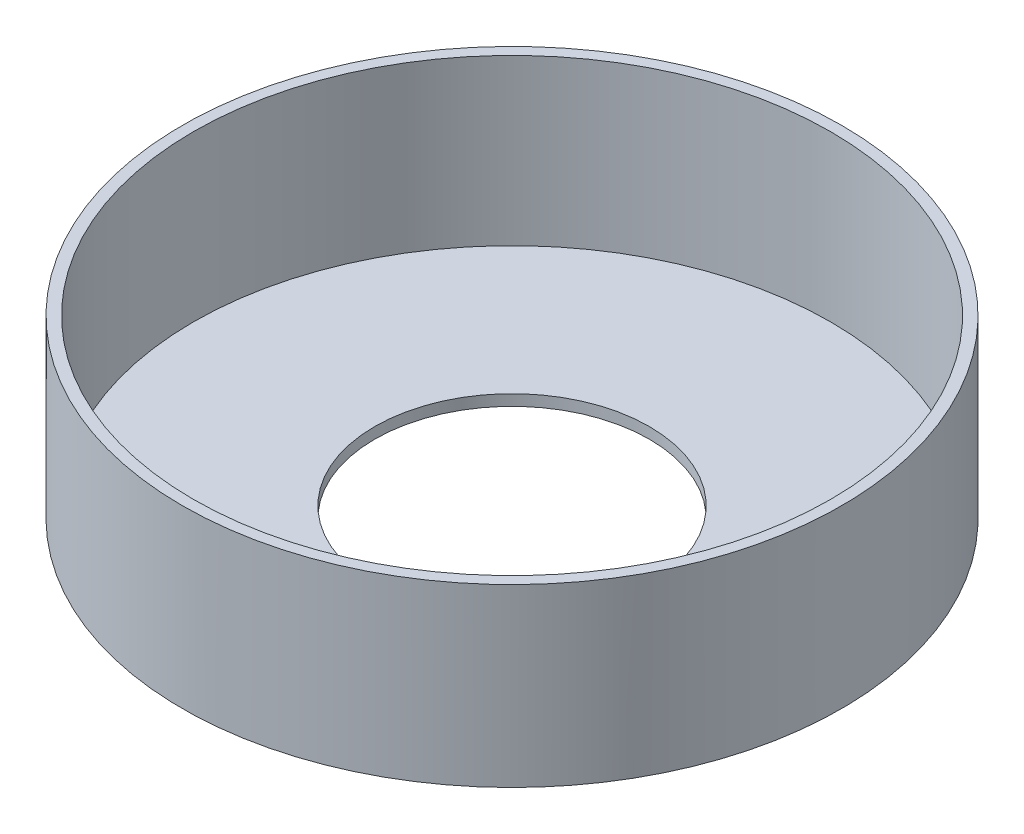
ISO-10303-21;
HEADER;
FILE_DESCRIPTION(('STEP AP214'),'2;1');
FILE_NAME('part.step','',(''),(''),'','','');
FILE_SCHEMA(('AUTOMOTIVE_DESIGN { 1 0 10303 214 1 1 1 1 }'));
ENDSEC;
DATA;
#1=APPLICATION_CONTEXT('core data for automotive mechanical design processes');
#2=APPLICATION_PROTOCOL_DEFINITION('international standard','automotive_design',2000,#1);
#3=PRODUCT_CONTEXT('',#1,'mechanical');
#4=PRODUCT('Part','Part','',(#3));
#5=PRODUCT_RELATED_PRODUCT_CATEGORY('part','',(#4));
#6=PRODUCT_DEFINITION_FORMATION('','',#4);
#7=PRODUCT_DEFINITION_CONTEXT('part definition',#1,'design');
#8=PRODUCT_DEFINITION('design','',#6,#7);
#9=PRODUCT_DEFINITION_SHAPE('','',#8);
#10=(LENGTH_UNIT() NAMED_UNIT(*) SI_UNIT(.MILLI.,.METRE.));
#11=(NAMED_UNIT(*) PLANE_ANGLE_UNIT() SI_UNIT($,.RADIAN.));
#12=(NAMED_UNIT(*) SI_UNIT($,.STERADIAN.) SOLID_ANGLE_UNIT());
#13=UNCERTAINTY_MEASURE_WITH_UNIT(LENGTH_MEASURE(1.E-05),#10,'distance_accuracy_value','');
#14=(GEOMETRIC_REPRESENTATION_CONTEXT(3) GLOBAL_UNCERTAINTY_ASSIGNED_CONTEXT((#13)) GLOBAL_UNIT_ASSIGNED_CONTEXT((#10,
#11,#12)) REPRESENTATION_CONTEXT('',''));
#15=CARTESIAN_POINT('',(0.,0.,0.));
#16=DIRECTION('',(0.,0.,1.));
#17=DIRECTION('',(1.,0.,0.));
#18=AXIS2_PLACEMENT_3D('',#15,#16,#17);
#19=CARTESIAN_POINT('',(0.,15.,0.));
#20=DIRECTION('',(0.,1.,0.));
#21=DIRECTION('',(0.,0.,1.));
#22=AXIS2_PLACEMENT_3D('',#19,#20,#21);
#23=PLANE('',#22);
#24=CARTESIAN_POINT('',(0.,15.,0.));
#25=DIRECTION('',(0.,1.,0.));
#26=DIRECTION('',(0.,0.,1.));
#27=AXIS2_PLACEMENT_3D('',#24,#25,#26);
#28=CIRCLE('',#27,30.);
#29=CARTESIAN_POINT('',(0.,15.,30.));
#30=VERTEX_POINT('',#29);
#31=EDGE_CURVE('E10',#30,#30,#28,.T.);
#32=ORIENTED_EDGE('',*,*,#31,.T.);
#33=EDGE_LOOP('',(#32));
#34=FACE_BOUND('',#33,.T.);
#35=CARTESIAN_POINT('',(0.,15.,0.));
#36=DIRECTION('',(0.,1.,0.));
#37=DIRECTION('',(0.,0.,1.));
#38=AXIS2_PLACEMENT_3D('',#35,#36,#37);
#39=CIRCLE('',#38,29.);
#40=CARTESIAN_POINT('',(0.,15.,29.));
#41=VERTEX_POINT('',#40);
#42=EDGE_CURVE('E45',#41,#41,#39,.T.);
#43=ORIENTED_EDGE('',*,*,#42,.F.);
#44=EDGE_LOOP('',(#43));
#45=FACE_BOUND('',#44,.T.);
#46=ADVANCED_FACE('F37',(#34,#45),#23,.T.);
#47=CARTESIAN_POINT('',(0.,15.,0.));
#48=DIRECTION('',(0.,-1.,0.));
#49=DIRECTION('',(0.,0.,-1.));
#50=AXIS2_PLACEMENT_3D('',#47,#48,#49);
#51=CYLINDRICAL_SURFACE('',#50,30.);
#52=ORIENTED_EDGE('',*,*,#31,.F.);
#53=EDGE_LOOP('',(#52));
#54=FACE_BOUND('',#53,.T.);
#55=CARTESIAN_POINT('',(0.,-1.,0.));
#56=DIRECTION('',(0.,-1.,0.));
#57=DIRECTION('',(0.,0.,-1.));
#58=AXIS2_PLACEMENT_3D('',#55,#56,#57);
#59=CIRCLE('',#58,30.);
#60=CARTESIAN_POINT('',(0.,-1.,-30.));
#61=VERTEX_POINT('',#60);
#62=EDGE_CURVE('E56',#61,#61,#59,.T.);
#63=ORIENTED_EDGE('',*,*,#62,.F.);
#64=EDGE_LOOP('',(#63));
#65=FACE_BOUND('',#64,.T.);
#66=ADVANCED_FACE('F39',(#54,#65),#51,.T.);
#67=CARTESIAN_POINT('',(0.,15.,0.));
#68=DIRECTION('',(0.,-1.,0.));
#69=DIRECTION('',(0.,0.,-1.));
#70=AXIS2_PLACEMENT_3D('',#67,#68,#69);
#71=CYLINDRICAL_SURFACE('',#70,29.);
#72=ORIENTED_EDGE('',*,*,#42,.T.);
#73=EDGE_LOOP('',(#72));
#74=FACE_BOUND('',#73,.T.);
#75=CARTESIAN_POINT('',(0.,0.,0.));
#76=DIRECTION('',(0.,1.,0.));
#77=DIRECTION('',(0.,0.,1.));
#78=AXIS2_PLACEMENT_3D('',#75,#76,#77);
#79=CIRCLE('',#78,29.);
#80=CARTESIAN_POINT('',(0.,0.,29.));
#81=VERTEX_POINT('',#80);
#82=EDGE_CURVE('E50',#81,#81,#79,.T.);
#83=ORIENTED_EDGE('',*,*,#82,.F.);
#84=EDGE_LOOP('',(#83));
#85=FACE_BOUND('',#84,.T.);
#86=ADVANCED_FACE('F83',(#74,#85),#71,.F.);
#87=CARTESIAN_POINT('',(0.,0.,0.));
#88=DIRECTION('',(0.,-1.,0.));
#89=DIRECTION('',(0.,0.,-1.));
#90=AXIS2_PLACEMENT_3D('',#87,#88,#89);
#91=PLANE('',#90);
#92=CARTESIAN_POINT('',(0.,0.,0.));
#93=DIRECTION('',(0.,-1.,0.));
#94=DIRECTION('',(0.,0.,-1.));
#95=AXIS2_PLACEMENT_3D('',#92,#93,#94);
#96=CIRCLE('',#95,12.5);
#97=CARTESIAN_POINT('',(0.,0.,-12.5));
#98=VERTEX_POINT('',#97);
#99=EDGE_CURVE('E62',#98,#98,#96,.T.);
#100=ORIENTED_EDGE('',*,*,#99,.T.);
#101=EDGE_LOOP('',(#100));
#102=FACE_BOUND('',#101,.T.);
#103=ORIENTED_EDGE('',*,*,#82,.T.);
#104=EDGE_LOOP('',(#103));
#105=FACE_BOUND('',#104,.T.);
#106=ADVANCED_FACE('F75',(#102,#105),#91,.F.);
#107=CARTESIAN_POINT('',(0.,-1.,0.));
#108=DIRECTION('',(0.,-1.,0.));
#109=DIRECTION('',(0.,0.,-1.));
#110=AXIS2_PLACEMENT_3D('',#107,#108,#109);
#111=PLANE('',#110);
#112=ORIENTED_EDGE('',*,*,#62,.T.);
#113=EDGE_LOOP('',(#112));
#114=FACE_BOUND('',#113,.T.);
#115=CARTESIAN_POINT('',(0.,-1.,0.));
#116=DIRECTION('',(0.,-1.,0.));
#117=DIRECTION('',(0.,0.,-1.));
#118=AXIS2_PLACEMENT_3D('',#115,#116,#117);
#119=CIRCLE('',#118,12.5);
#120=CARTESIAN_POINT('',(0.,-1.,-12.5));
#121=VERTEX_POINT('',#120);
#122=EDGE_CURVE('E61',#121,#121,#119,.T.);
#123=ORIENTED_EDGE('',*,*,#122,.F.);
#124=EDGE_LOOP('',(#123));
#125=FACE_BOUND('',#124,.T.);
#126=ADVANCED_FACE('F73',(#114,#125),#111,.T.);
#127=CARTESIAN_POINT('',(0.,-1.,0.));
#128=DIRECTION('',(0.,1.,0.));
#129=DIRECTION('',(0.,0.,1.));
#130=AXIS2_PLACEMENT_3D('',#127,#128,#129);
#131=CYLINDRICAL_SURFACE('',#130,12.5);
#132=ORIENTED_EDGE('',*,*,#122,.T.);
#133=EDGE_LOOP('',(#132));
#134=FACE_BOUND('',#133,.T.);
#135=ORIENTED_EDGE('',*,*,#99,.F.);
#136=EDGE_LOOP('',(#135));
#137=FACE_BOUND('',#136,.T.);
#138=ADVANCED_FACE('F70',(#134,#137),#131,.F.);
#139=CLOSED_SHELL('',(#46,#66,#86,#106,#126,#138));
#140=MANIFOLD_SOLID_BREP('B2',#139);
#141=ADVANCED_BREP_SHAPE_REPRESENTATION('',(#18,#140),#14);
#142=SHAPE_DEFINITION_REPRESENTATION(#9,#141);
ENDSEC;
END-ISO-10303-21;
